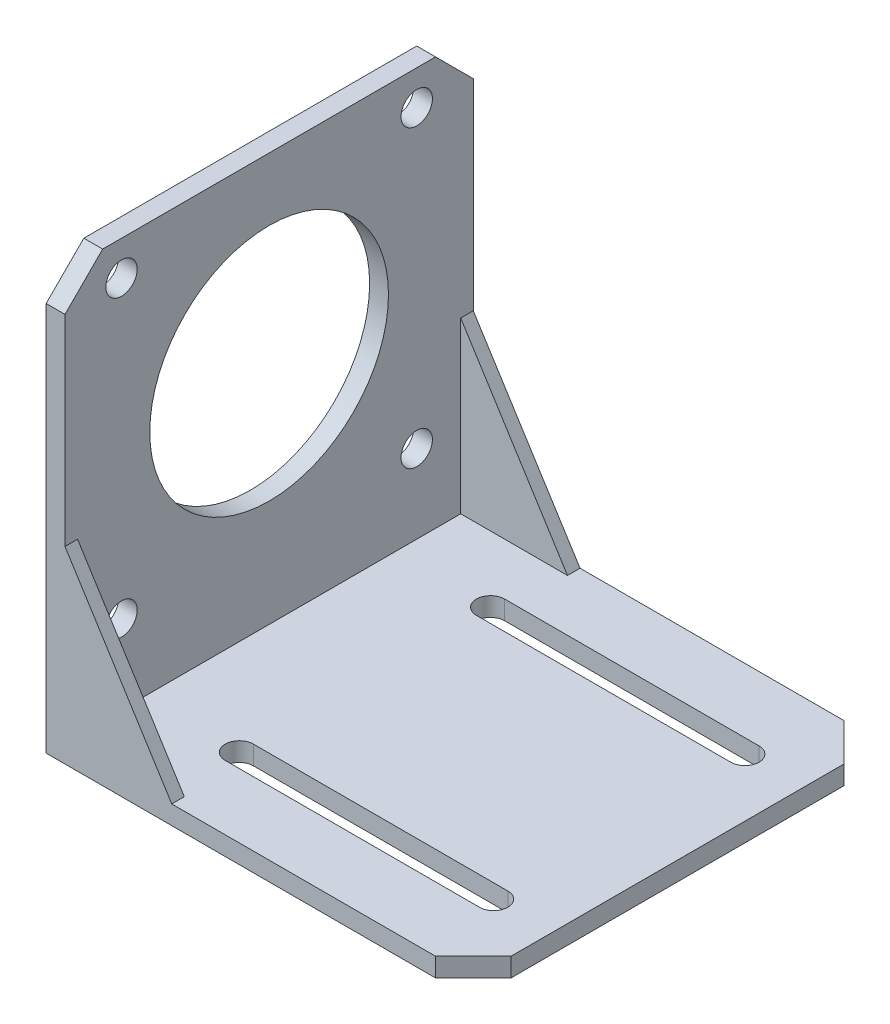
ISO-10303-21;
HEADER;
FILE_DESCRIPTION(('STEP AP214'),'2;1');
FILE_NAME('part.step','',(''),(''),'','','');
FILE_SCHEMA(('AUTOMOTIVE_DESIGN { 1 0 10303 214 1 1 1 1 }'));
ENDSEC;
DATA;
#1=APPLICATION_CONTEXT('core data for automotive mechanical design processes');
#2=APPLICATION_PROTOCOL_DEFINITION('international standard','automotive_design',2000,#1);
#3=PRODUCT_CONTEXT('',#1,'mechanical');
#4=PRODUCT('Part','Part','',(#3));
#5=PRODUCT_RELATED_PRODUCT_CATEGORY('part','',(#4));
#6=PRODUCT_DEFINITION_FORMATION('','',#4);
#7=PRODUCT_DEFINITION_CONTEXT('part definition',#1,'design');
#8=PRODUCT_DEFINITION('design','',#6,#7);
#9=PRODUCT_DEFINITION_SHAPE('','',#8);
#10=(LENGTH_UNIT() NAMED_UNIT(*) SI_UNIT(.MILLI.,.METRE.));
#11=(NAMED_UNIT(*) PLANE_ANGLE_UNIT() SI_UNIT($,.RADIAN.));
#12=(NAMED_UNIT(*) SI_UNIT($,.STERADIAN.) SOLID_ANGLE_UNIT());
#13=UNCERTAINTY_MEASURE_WITH_UNIT(LENGTH_MEASURE(1.E-05),#10,'distance_accuracy_value','');
#14=(GEOMETRIC_REPRESENTATION_CONTEXT(3) GLOBAL_UNCERTAINTY_ASSIGNED_CONTEXT((#13)) GLOBAL_UNIT_ASSIGNED_CONTEXT((#10,
#11,#12)) REPRESENTATION_CONTEXT('',''));
#15=CARTESIAN_POINT('',(0.,0.,0.));
#16=DIRECTION('',(0.,0.,1.));
#17=DIRECTION('',(1.,0.,0.));
#18=AXIS2_PLACEMENT_3D('',#15,#16,#17);
#19=CARTESIAN_POINT('',(68.,0.,65.));
#20=DIRECTION('',(0.,1.,0.));
#21=DIRECTION('',(0.,0.,1.));
#22=AXIS2_PLACEMENT_3D('',#19,#20,#21);
#23=PLANE('',#22);
#24=DIRECTION('',(0.707106781186545,0.,-0.70710678118655));
#25=VECTOR('',#24,1.);
#26=CARTESIAN_POINT('',(62.,0.,65.));
#27=LINE('',#26,#25);
#28=CARTESIAN_POINT('',(68.,0.,59.));
#29=VERTEX_POINT('',#28);
#30=CARTESIAN_POINT('',(62.,0.,65.));
#31=VERTEX_POINT('',#30);
#32=EDGE_CURVE('E402',#29,#31,#27,.F.);
#33=ORIENTED_EDGE('',*,*,#32,.T.);
#34=DIRECTION('',(1.,0.,0.));
#35=VECTOR('',#34,1.);
#36=CARTESIAN_POINT('',(68.,0.,65.));
#37=LINE('',#36,#35);
#38=CARTESIAN_POINT('',(0.,0.,65.));
#39=VERTEX_POINT('',#38);
#40=EDGE_CURVE('E353',#39,#31,#37,.T.);
#41=ORIENTED_EDGE('',*,*,#40,.F.);
#42=DIRECTION('',(0.,0.,-1.));
#43=VECTOR('',#42,1.);
#44=CARTESIAN_POINT('',(0.,0.,65.));
#45=LINE('',#44,#43);
#46=CARTESIAN_POINT('',(0.,0.,0.));
#47=VERTEX_POINT('',#46);
#48=EDGE_CURVE('E362',#39,#47,#45,.T.);
#49=ORIENTED_EDGE('',*,*,#48,.T.);
#50=DIRECTION('',(1.,0.,0.));
#51=VECTOR('',#50,1.);
#52=CARTESIAN_POINT('',(68.,0.,0.));
#53=LINE('',#52,#51);
#54=CARTESIAN_POINT('',(62.,0.,0.));
#55=VERTEX_POINT('',#54);
#56=EDGE_CURVE('E363',#47,#55,#53,.T.);
#57=ORIENTED_EDGE('',*,*,#56,.T.);
#58=DIRECTION('',(0.70710678118655,0.,0.707106781186546));
#59=VECTOR('',#58,1.);
#60=CARTESIAN_POINT('',(68.,0.,5.99999999999999));
#61=LINE('',#60,#59);
#62=CARTESIAN_POINT('',(68.,0.,6.));
#63=VERTEX_POINT('',#62);
#64=EDGE_CURVE('E405',#55,#63,#61,.T.);
#65=ORIENTED_EDGE('',*,*,#64,.T.);
#66=DIRECTION('',(0.,0.,-1.));
#67=VECTOR('',#66,1.);
#68=CARTESIAN_POINT('',(68.,0.,65.));
#69=LINE('',#68,#67);
#70=EDGE_CURVE('E384',#29,#63,#69,.T.);
#71=ORIENTED_EDGE('',*,*,#70,.F.);
#72=EDGE_LOOP('',(#33,#41,#49,#57,#65,#71));
#73=FACE_BOUND('',#72,.T.);
#74=DIRECTION('',(1.,0.,0.));
#75=VECTOR('',#74,1.);
#76=CARTESIAN_POINT('',(18.25,0.,50.25));
#77=LINE('',#76,#75);
#78=CARTESIAN_POINT('',(18.25,0.,50.25));
#79=VERTEX_POINT('',#78);
#80=CARTESIAN_POINT('',(58.75,0.,50.25));
#81=VERTEX_POINT('',#80);
#82=EDGE_CURVE('E505',#79,#81,#77,.T.);
#83=ORIENTED_EDGE('',*,*,#82,.F.);
#84=CARTESIAN_POINT('',(18.25,0.,52.5));
#85=DIRECTION('',(0.,1.,0.));
#86=DIRECTION('',(0.,0.,1.));
#87=AXIS2_PLACEMENT_3D('',#84,#85,#86);
#88=CIRCLE('',#87,2.25);
#89=CARTESIAN_POINT('',(18.25,0.,54.75));
#90=VERTEX_POINT('',#89);
#91=EDGE_CURVE('E513',#79,#90,#88,.T.);
#92=ORIENTED_EDGE('',*,*,#91,.T.);
#93=DIRECTION('',(1.,0.,0.));
#94=VECTOR('',#93,1.);
#95=CARTESIAN_POINT('',(18.25,0.,54.75));
#96=LINE('',#95,#94);
#97=CARTESIAN_POINT('',(58.75,0.,54.75));
#98=VERTEX_POINT('',#97);
#99=EDGE_CURVE('E502',#90,#98,#96,.T.);
#100=ORIENTED_EDGE('',*,*,#99,.T.);
#101=CARTESIAN_POINT('',(58.75,0.,52.5));
#102=DIRECTION('',(0.,1.,0.));
#103=DIRECTION('',(0.,0.,1.));
#104=AXIS2_PLACEMENT_3D('',#101,#102,#103);
#105=CIRCLE('',#104,2.25);
#106=EDGE_CURVE('E523',#98,#81,#105,.T.);
#107=ORIENTED_EDGE('',*,*,#106,.T.);
#108=EDGE_LOOP('',(#83,#92,#100,#107));
#109=FACE_BOUND('',#108,.T.);
#110=DIRECTION('',(1.,0.,0.));
#111=VECTOR('',#110,1.);
#112=CARTESIAN_POINT('',(18.25,0.,10.25));
#113=LINE('',#112,#111);
#114=CARTESIAN_POINT('',(18.25,0.,10.25));
#115=VERTEX_POINT('',#114);
#116=CARTESIAN_POINT('',(58.75,0.,10.25));
#117=VERTEX_POINT('',#116);
#118=EDGE_CURVE('E535',#115,#117,#113,.T.);
#119=ORIENTED_EDGE('',*,*,#118,.F.);
#120=CARTESIAN_POINT('',(18.25,0.,12.5));
#121=DIRECTION('',(0.,1.,0.));
#122=DIRECTION('',(0.,0.,1.));
#123=AXIS2_PLACEMENT_3D('',#120,#121,#122);
#124=CIRCLE('',#123,2.25);
#125=CARTESIAN_POINT('',(18.25,0.,14.75));
#126=VERTEX_POINT('',#125);
#127=EDGE_CURVE('E544',#115,#126,#124,.T.);
#128=ORIENTED_EDGE('',*,*,#127,.T.);
#129=DIRECTION('',(1.,0.,0.));
#130=VECTOR('',#129,1.);
#131=CARTESIAN_POINT('',(18.25,0.,14.75));
#132=LINE('',#131,#130);
#133=CARTESIAN_POINT('',(58.75,0.,14.75));
#134=VERTEX_POINT('',#133);
#135=EDGE_CURVE('E532',#126,#134,#132,.T.);
#136=ORIENTED_EDGE('',*,*,#135,.T.);
#137=CARTESIAN_POINT('',(58.75,0.,12.5));
#138=DIRECTION('',(0.,1.,0.));
#139=DIRECTION('',(0.,0.,1.));
#140=AXIS2_PLACEMENT_3D('',#137,#138,#139);
#141=CIRCLE('',#140,2.25);
#142=EDGE_CURVE('E554',#134,#117,#141,.T.);
#143=ORIENTED_EDGE('',*,*,#142,.T.);
#144=EDGE_LOOP('',(#119,#128,#136,#143));
#145=FACE_BOUND('',#144,.T.);
#146=ADVANCED_FACE('F182',(#73,#109,#145),#23,.F.);
#147=CARTESIAN_POINT('',(68.,3.,65.));
#148=DIRECTION('',(-1.,0.,0.));
#149=DIRECTION('',(0.,0.,1.));
#150=AXIS2_PLACEMENT_3D('',#147,#148,#149);
#151=PLANE('',#150);
#152=ORIENTED_EDGE('',*,*,#70,.T.);
#153=DIRECTION('',(0.,1.,0.));
#154=VECTOR('',#153,1.);
#155=CARTESIAN_POINT('',(68.,3.,5.99999999999999));
#156=LINE('',#155,#154);
#157=CARTESIAN_POINT('',(68.,3.,6.));
#158=VERTEX_POINT('',#157);
#159=EDGE_CURVE('E389',#63,#158,#156,.T.);
#160=ORIENTED_EDGE('',*,*,#159,.T.);
#161=DIRECTION('',(0.,0.,-1.));
#162=VECTOR('',#161,1.);
#163=CARTESIAN_POINT('',(68.,3.,65.));
#164=LINE('',#163,#162);
#165=CARTESIAN_POINT('',(68.,3.,59.));
#166=VERTEX_POINT('',#165);
#167=EDGE_CURVE('E381',#166,#158,#164,.T.);
#168=ORIENTED_EDGE('',*,*,#167,.F.);
#169=DIRECTION('',(0.,-1.,0.));
#170=VECTOR('',#169,1.);
#171=CARTESIAN_POINT('',(68.,3.,59.));
#172=LINE('',#171,#170);
#173=EDGE_CURVE('E387',#166,#29,#172,.T.);
#174=ORIENTED_EDGE('',*,*,#173,.T.);
#175=EDGE_LOOP('',(#152,#160,#168,#174));
#176=FACE_BOUND('',#175,.T.);
#177=ADVANCED_FACE('F587',(#176),#151,.F.);
#178=CARTESIAN_POINT('',(3.00000000000001,3.,65.));
#179=DIRECTION('',(0.,-1.,0.));
#180=DIRECTION('',(1.,0.,0.));
#181=AXIS2_PLACEMENT_3D('',#178,#179,#180);
#182=PLANE('',#181);
#183=DIRECTION('',(1.,0.,0.));
#184=VECTOR('',#183,1.);
#185=CARTESIAN_POINT('',(18.25,3.,50.25));
#186=LINE('',#185,#184);
#187=CARTESIAN_POINT('',(18.25,3.,50.25));
#188=VERTEX_POINT('',#187);
#189=CARTESIAN_POINT('',(58.75,3.,50.25));
#190=VERTEX_POINT('',#189);
#191=EDGE_CURVE('E507',#188,#190,#186,.T.);
#192=ORIENTED_EDGE('',*,*,#191,.T.);
#193=CARTESIAN_POINT('',(58.75,3.,52.5));
#194=DIRECTION('',(0.,1.,0.));
#195=DIRECTION('',(0.,0.,1.));
#196=AXIS2_PLACEMENT_3D('',#193,#194,#195);
#197=CIRCLE('',#196,2.24999999999999);
#198=CARTESIAN_POINT('',(58.75,3.,54.7500000000001));
#199=VERTEX_POINT('',#198);
#200=EDGE_CURVE('E520',#199,#190,#197,.T.);
#201=ORIENTED_EDGE('',*,*,#200,.F.);
#202=DIRECTION('',(1.,0.,0.));
#203=VECTOR('',#202,1.);
#204=CARTESIAN_POINT('',(18.25,3.,54.7500000000001));
#205=LINE('',#204,#203);
#206=CARTESIAN_POINT('',(18.25,3.,54.75));
#207=VERTEX_POINT('',#206);
#208=EDGE_CURVE('E500',#207,#199,#205,.T.);
#209=ORIENTED_EDGE('',*,*,#208,.F.);
#210=CARTESIAN_POINT('',(18.25,3.,52.5));
#211=DIRECTION('',(0.,1.,0.));
#212=DIRECTION('',(0.,0.,1.));
#213=AXIS2_PLACEMENT_3D('',#210,#211,#212);
#214=CIRCLE('',#213,2.24999999999999);
#215=EDGE_CURVE('E510',#188,#207,#214,.T.);
#216=ORIENTED_EDGE('',*,*,#215,.F.);
#217=EDGE_LOOP('',(#192,#201,#209,#216));
#218=FACE_BOUND('',#217,.T.);
#219=CARTESIAN_POINT('',(58.75,3.,12.5));
#220=DIRECTION('',(0.,1.,0.));
#221=DIRECTION('',(0.,0.,1.));
#222=AXIS2_PLACEMENT_3D('',#219,#220,#221);
#223=CIRCLE('',#222,2.24999999999999);
#224=CARTESIAN_POINT('',(58.75,3.,14.75));
#225=VERTEX_POINT('',#224);
#226=CARTESIAN_POINT('',(58.75,3.,10.25));
#227=VERTEX_POINT('',#226);
#228=EDGE_CURVE('E551',#225,#227,#223,.T.);
#229=ORIENTED_EDGE('',*,*,#228,.F.);
#230=DIRECTION('',(1.,0.,0.));
#231=VECTOR('',#230,1.);
#232=CARTESIAN_POINT('',(18.25,3.,14.75));
#233=LINE('',#232,#231);
#234=CARTESIAN_POINT('',(18.25,3.,14.75));
#235=VERTEX_POINT('',#234);
#236=EDGE_CURVE('E530',#235,#225,#233,.T.);
#237=ORIENTED_EDGE('',*,*,#236,.F.);
#238=CARTESIAN_POINT('',(18.25,3.,12.5));
#239=DIRECTION('',(0.,1.,0.));
#240=DIRECTION('',(0.,0.,1.));
#241=AXIS2_PLACEMENT_3D('',#238,#239,#240);
#242=CIRCLE('',#241,2.24999999999999);
#243=CARTESIAN_POINT('',(18.25,3.,10.25));
#244=VERTEX_POINT('',#243);
#245=EDGE_CURVE('E541',#244,#235,#242,.T.);
#246=ORIENTED_EDGE('',*,*,#245,.F.);
#247=DIRECTION('',(1.,0.,0.));
#248=VECTOR('',#247,1.);
#249=CARTESIAN_POINT('',(18.25,3.,10.25));
#250=LINE('',#249,#248);
#251=EDGE_CURVE('E538',#244,#227,#250,.T.);
#252=ORIENTED_EDGE('',*,*,#251,.T.);
#253=EDGE_LOOP('',(#229,#237,#246,#252));
#254=FACE_BOUND('',#253,.T.);
#255=DIRECTION('',(-1.,0.,0.));
#256=VECTOR('',#255,1.);
#257=CARTESIAN_POINT('',(3.00000000000001,3.,63.));
#258=LINE('',#257,#256);
#259=CARTESIAN_POINT('',(20.,3.,63.));
#260=VERTEX_POINT('',#259);
#261=CARTESIAN_POINT('',(3.00000000000001,3.,63.));
#262=VERTEX_POINT('',#261);
#263=EDGE_CURVE('E345',#260,#262,#258,.T.);
#264=ORIENTED_EDGE('',*,*,#263,.F.);
#265=DIRECTION('',(0.,0.,-1.));
#266=VECTOR('',#265,1.);
#267=CARTESIAN_POINT('',(20.,3.,65.));
#268=LINE('',#267,#266);
#269=CARTESIAN_POINT('',(20.,3.00000000000001,65.));
#270=VERTEX_POINT('',#269);
#271=EDGE_CURVE('E333',#260,#270,#268,.F.);
#272=ORIENTED_EDGE('',*,*,#271,.T.);
#273=DIRECTION('',(-1.,0.,0.));
#274=VECTOR('',#273,1.);
#275=CARTESIAN_POINT('',(3.00000000000001,3.,65.));
#276=LINE('',#275,#274);
#277=CARTESIAN_POINT('',(62.,3.,65.));
#278=VERTEX_POINT('',#277);
#279=EDGE_CURVE('E343',#278,#270,#276,.T.);
#280=ORIENTED_EDGE('',*,*,#279,.F.);
#281=DIRECTION('',(-0.707106781186545,0.,0.70710678118655));
#282=VECTOR('',#281,1.);
#283=CARTESIAN_POINT('',(62.,3.,65.));
#284=LINE('',#283,#282);
#285=EDGE_CURVE('E392',#278,#166,#284,.F.);
#286=ORIENTED_EDGE('',*,*,#285,.T.);
#287=ORIENTED_EDGE('',*,*,#167,.T.);
#288=DIRECTION('',(-0.70710678118655,0.,-0.707106781186546));
#289=VECTOR('',#288,1.);
#290=CARTESIAN_POINT('',(68.,3.,5.99999999999999));
#291=LINE('',#290,#289);
#292=CARTESIAN_POINT('',(62.,3.,0.));
#293=VERTEX_POINT('',#292);
#294=EDGE_CURVE('E394',#158,#293,#291,.T.);
#295=ORIENTED_EDGE('',*,*,#294,.T.);
#296=DIRECTION('',(-1.,0.,0.));
#297=VECTOR('',#296,1.);
#298=CARTESIAN_POINT('',(3.00000000000001,3.,0.));
#299=LINE('',#298,#297);
#300=CARTESIAN_POINT('',(20.,3.,0.));
#301=VERTEX_POINT('',#300);
#302=EDGE_CURVE('E365',#293,#301,#299,.T.);
#303=ORIENTED_EDGE('',*,*,#302,.T.);
#304=DIRECTION('',(0.,0.,-1.));
#305=VECTOR('',#304,1.);
#306=CARTESIAN_POINT('',(20.,3.,65.));
#307=LINE('',#306,#305);
#308=CARTESIAN_POINT('',(20.,3.,2.));
#309=VERTEX_POINT('',#308);
#310=EDGE_CURVE('E205',#301,#309,#307,.F.);
#311=ORIENTED_EDGE('',*,*,#310,.T.);
#312=DIRECTION('',(-1.,0.,0.));
#313=VECTOR('',#312,1.);
#314=CARTESIAN_POINT('',(3.00000000000001,3.,2.));
#315=LINE('',#314,#313);
#316=CARTESIAN_POINT('',(3.00000000000001,3.,2.));
#317=VERTEX_POINT('',#316);
#318=EDGE_CURVE('E468',#309,#317,#315,.T.);
#319=ORIENTED_EDGE('',*,*,#318,.T.);
#320=DIRECTION('',(0.,0.,-1.));
#321=VECTOR('',#320,1.);
#322=CARTESIAN_POINT('',(3.00000000000001,3.,65.));
#323=LINE('',#322,#321);
#324=EDGE_CURVE('E379',#262,#317,#323,.T.);
#325=ORIENTED_EDGE('',*,*,#324,.F.);
#326=EDGE_LOOP('',(#264,#272,#280,#286,#287,#295,#303,#311,#319,#325));
#327=FACE_BOUND('',#326,.T.);
#328=ADVANCED_FACE('F342',(#218,#254,#327),#182,.F.);
#329=CARTESIAN_POINT('',(3.,68.,65.));
#330=DIRECTION('',(-1.,0.,0.));
#331=DIRECTION('',(0.,-1.,0.));
#332=AXIS2_PLACEMENT_3D('',#329,#330,#331);
#333=PLANE('',#332);
#334=CARTESIAN_POINT('',(3.,62.5,9.00000000000001));
#335=DIRECTION('',(-1.,0.,0.));
#336=DIRECTION('',(0.,-1.,0.));
#337=AXIS2_PLACEMENT_3D('',#334,#335,#336);
#338=CIRCLE('',#337,2.5);
#339=CARTESIAN_POINT('',(3.,60.,9.00000000000001));
#340=VERTEX_POINT('',#339);
#341=EDGE_CURVE('E473',#340,#340,#338,.T.);
#342=ORIENTED_EDGE('',*,*,#341,.T.);
#343=EDGE_LOOP('',(#342));
#344=FACE_BOUND('',#343,.T.);
#345=CARTESIAN_POINT('',(3.,62.5,56.));
#346=DIRECTION('',(-1.,0.,0.));
#347=DIRECTION('',(0.,-1.,0.));
#348=AXIS2_PLACEMENT_3D('',#345,#346,#347);
#349=CIRCLE('',#348,2.5);
#350=CARTESIAN_POINT('',(3.,60.,56.));
#351=VERTEX_POINT('',#350);
#352=EDGE_CURVE('E479',#351,#351,#349,.T.);
#353=ORIENTED_EDGE('',*,*,#352,.T.);
#354=EDGE_LOOP('',(#353));
#355=FACE_BOUND('',#354,.T.);
#356=CARTESIAN_POINT('',(3.00000000000001,15.5,9.00000000000001));
#357=DIRECTION('',(-1.,0.,0.));
#358=DIRECTION('',(0.,-1.,0.));
#359=AXIS2_PLACEMENT_3D('',#356,#357,#358);
#360=CIRCLE('',#359,2.5);
#361=CARTESIAN_POINT('',(3.00000000000001,13.,9.00000000000001));
#362=VERTEX_POINT('',#361);
#363=EDGE_CURVE('E485',#362,#362,#360,.T.);
#364=ORIENTED_EDGE('',*,*,#363,.T.);
#365=EDGE_LOOP('',(#364));
#366=FACE_BOUND('',#365,.T.);
#367=CARTESIAN_POINT('',(3.00000000000001,15.5,56.));
#368=DIRECTION('',(-1.,0.,0.));
#369=DIRECTION('',(0.,-1.,0.));
#370=AXIS2_PLACEMENT_3D('',#367,#368,#369);
#371=CIRCLE('',#370,2.5);
#372=CARTESIAN_POINT('',(3.00000000000001,13.,56.));
#373=VERTEX_POINT('',#372);
#374=EDGE_CURVE('E491',#373,#373,#371,.T.);
#375=ORIENTED_EDGE('',*,*,#374,.T.);
#376=EDGE_LOOP('',(#375));
#377=FACE_BOUND('',#376,.T.);
#378=CARTESIAN_POINT('',(3.00000000000001,39.,32.5));
#379=DIRECTION('',(-1.,0.,0.));
#380=DIRECTION('',(0.,-1.,0.));
#381=AXIS2_PLACEMENT_3D('',#378,#379,#380);
#382=CIRCLE('',#381,19.);
#383=CARTESIAN_POINT('',(3.00000000000001,20.,32.5));
#384=VERTEX_POINT('',#383);
#385=EDGE_CURVE('E497',#384,#384,#382,.T.);
#386=ORIENTED_EDGE('',*,*,#385,.T.);
#387=EDGE_LOOP('',(#386));
#388=FACE_BOUND('',#387,.T.);
#389=DIRECTION('',(0.,1.,0.));
#390=VECTOR('',#389,1.);
#391=CARTESIAN_POINT('',(3.,68.,65.));
#392=LINE('',#391,#390);
#393=CARTESIAN_POINT('',(3.,30.,65.));
#394=VERTEX_POINT('',#393);
#395=CARTESIAN_POINT('',(3.,62.,65.));
#396=VERTEX_POINT('',#395);
#397=EDGE_CURVE('E352',#394,#396,#392,.T.);
#398=ORIENTED_EDGE('',*,*,#397,.F.);
#399=DIRECTION('',(0.,0.,1.));
#400=VECTOR('',#399,1.);
#401=CARTESIAN_POINT('',(3.,30.,65.));
#402=LINE('',#401,#400);
#403=CARTESIAN_POINT('',(3.00000000000001,30.,63.));
#404=VERTEX_POINT('',#403);
#405=EDGE_CURVE('E336',#394,#404,#402,.F.);
#406=ORIENTED_EDGE('',*,*,#405,.T.);
#407=DIRECTION('',(0.,1.,0.));
#408=VECTOR('',#407,1.);
#409=CARTESIAN_POINT('',(3.,68.,63.));
#410=LINE('',#409,#408);
#411=EDGE_CURVE('E346',#262,#404,#410,.T.);
#412=ORIENTED_EDGE('',*,*,#411,.F.);
#413=ORIENTED_EDGE('',*,*,#324,.T.);
#414=DIRECTION('',(0.,1.,0.));
#415=VECTOR('',#414,1.);
#416=CARTESIAN_POINT('',(3.,68.,2.));
#417=LINE('',#416,#415);
#418=CARTESIAN_POINT('',(3.00000000000001,30.,2.));
#419=VERTEX_POINT('',#418);
#420=EDGE_CURVE('E466',#317,#419,#417,.T.);
#421=ORIENTED_EDGE('',*,*,#420,.T.);
#422=DIRECTION('',(0.,0.,1.));
#423=VECTOR('',#422,1.);
#424=CARTESIAN_POINT('',(3.,30.,65.));
#425=LINE('',#424,#423);
#426=CARTESIAN_POINT('',(3.,30.,0.));
#427=VERTEX_POINT('',#426);
#428=EDGE_CURVE('E461',#419,#427,#425,.F.);
#429=ORIENTED_EDGE('',*,*,#428,.T.);
#430=DIRECTION('',(0.,1.,0.));
#431=VECTOR('',#430,1.);
#432=CARTESIAN_POINT('',(3.,68.,0.));
#433=LINE('',#432,#431);
#434=CARTESIAN_POINT('',(3.,62.,0.));
#435=VERTEX_POINT('',#434);
#436=EDGE_CURVE('E368',#427,#435,#433,.T.);
#437=ORIENTED_EDGE('',*,*,#436,.T.);
#438=DIRECTION('',(0.,0.70710678118655,0.707106781186546));
#439=VECTOR('',#438,1.);
#440=CARTESIAN_POINT('',(3.,68.,5.99999999999999));
#441=LINE('',#440,#439);
#442=CARTESIAN_POINT('',(3.,68.,6.));
#443=VERTEX_POINT('',#442);
#444=EDGE_CURVE('E190',#435,#443,#441,.T.);
#445=ORIENTED_EDGE('',*,*,#444,.T.);
#446=DIRECTION('',(0.,0.,-1.));
#447=VECTOR('',#446,1.);
#448=CARTESIAN_POINT('',(3.,68.,65.));
#449=LINE('',#448,#447);
#450=CARTESIAN_POINT('',(3.,68.,59.));
#451=VERTEX_POINT('',#450);
#452=EDGE_CURVE('E376',#451,#443,#449,.T.);
#453=ORIENTED_EDGE('',*,*,#452,.F.);
#454=DIRECTION('',(0.,0.707106781186545,-0.70710678118655));
#455=VECTOR('',#454,1.);
#456=CARTESIAN_POINT('',(3.,62.,65.));
#457=LINE('',#456,#455);
#458=EDGE_CURVE('E13',#451,#396,#457,.F.);
#459=ORIENTED_EDGE('',*,*,#458,.T.);
#460=EDGE_LOOP('',(#398,#406,#412,#413,#421,#429,#437,#445,#453,#459));
#461=FACE_BOUND('',#460,.T.);
#462=ADVANCED_FACE('F422',(#344,#355,#366,#377,#388,#461),#333,.F.);
#463=CARTESIAN_POINT('',(0.,68.,65.));
#464=DIRECTION('',(0.,-1.,0.));
#465=DIRECTION('',(0.,0.,-1.));
#466=AXIS2_PLACEMENT_3D('',#463,#464,#465);
#467=PLANE('',#466);
#468=DIRECTION('',(0.,0.,-1.));
#469=VECTOR('',#468,1.);
#470=CARTESIAN_POINT('',(0.,68.,65.));
#471=LINE('',#470,#469);
#472=CARTESIAN_POINT('',(0.,68.,59.));
#473=VERTEX_POINT('',#472);
#474=CARTESIAN_POINT('',(0.,68.,6.));
#475=VERTEX_POINT('',#474);
#476=EDGE_CURVE('E373',#473,#475,#471,.T.);
#477=ORIENTED_EDGE('',*,*,#476,.F.);
#478=DIRECTION('',(1.,0.,0.));
#479=VECTOR('',#478,1.);
#480=CARTESIAN_POINT('',(0.,68.,59.));
#481=LINE('',#480,#479);
#482=EDGE_CURVE('E418',#473,#451,#481,.T.);
#483=ORIENTED_EDGE('',*,*,#482,.T.);
#484=ORIENTED_EDGE('',*,*,#452,.T.);
#485=DIRECTION('',(-1.,0.,0.));
#486=VECTOR('',#485,1.);
#487=CARTESIAN_POINT('',(0.,68.,5.99999999999999));
#488=LINE('',#487,#486);
#489=EDGE_CURVE('E415',#443,#475,#488,.T.);
#490=ORIENTED_EDGE('',*,*,#489,.T.);
#491=EDGE_LOOP('',(#477,#483,#484,#490));
#492=FACE_BOUND('',#491,.T.);
#493=ADVANCED_FACE('F430',(#492),#467,.F.);
#494=CARTESIAN_POINT('',(0.,0.,65.));
#495=DIRECTION('',(1.,0.,0.));
#496=DIRECTION('',(0.,0.,-1.));
#497=AXIS2_PLACEMENT_3D('',#494,#495,#496);
#498=PLANE('',#497);
#499=ORIENTED_EDGE('',*,*,#48,.F.);
#500=DIRECTION('',(0.,-1.,0.));
#501=VECTOR('',#500,1.);
#502=CARTESIAN_POINT('',(0.,0.,65.));
#503=LINE('',#502,#501);
#504=CARTESIAN_POINT('',(0.,62.,65.));
#505=VERTEX_POINT('',#504);
#506=EDGE_CURVE('E355',#505,#39,#503,.T.);
#507=ORIENTED_EDGE('',*,*,#506,.F.);
#508=DIRECTION('',(0.,-0.707106781186545,0.70710678118655));
#509=VECTOR('',#508,1.);
#510=CARTESIAN_POINT('',(0.,62.,65.));
#511=LINE('',#510,#509);
#512=EDGE_CURVE('E413',#505,#473,#511,.F.);
#513=ORIENTED_EDGE('',*,*,#512,.T.);
#514=ORIENTED_EDGE('',*,*,#476,.T.);
#515=DIRECTION('',(0.,-0.70710678118655,-0.707106781186546));
#516=VECTOR('',#515,1.);
#517=CARTESIAN_POINT('',(0.,68.,5.99999999999999));
#518=LINE('',#517,#516);
#519=CARTESIAN_POINT('',(0.,62.,0.));
#520=VERTEX_POINT('',#519);
#521=EDGE_CURVE('E411',#475,#520,#518,.T.);
#522=ORIENTED_EDGE('',*,*,#521,.T.);
#523=DIRECTION('',(0.,-1.,0.));
#524=VECTOR('',#523,1.);
#525=CARTESIAN_POINT('',(0.,0.,0.));
#526=LINE('',#525,#524);
#527=EDGE_CURVE('E357',#520,#47,#526,.T.);
#528=ORIENTED_EDGE('',*,*,#527,.T.);
#529=EDGE_LOOP('',(#499,#507,#513,#514,#522,#528));
#530=FACE_BOUND('',#529,.T.);
#531=CARTESIAN_POINT('',(0.,62.5,9.00000000000001));
#532=DIRECTION('',(-1.,0.,0.));
#533=DIRECTION('',(0.,0.,1.));
#534=AXIS2_PLACEMENT_3D('',#531,#532,#533);
#535=CIRCLE('',#534,2.5);
#536=CARTESIAN_POINT('',(0.,62.5,11.5));
#537=VERTEX_POINT('',#536);
#538=EDGE_CURVE('E470',#537,#537,#535,.T.);
#539=ORIENTED_EDGE('',*,*,#538,.F.);
#540=EDGE_LOOP('',(#539));
#541=FACE_BOUND('',#540,.T.);
#542=CARTESIAN_POINT('',(0.,62.5,56.));
#543=DIRECTION('',(-1.,0.,0.));
#544=DIRECTION('',(0.,0.,1.));
#545=AXIS2_PLACEMENT_3D('',#542,#543,#544);
#546=CIRCLE('',#545,2.5);
#547=CARTESIAN_POINT('',(0.,62.5,58.5));
#548=VERTEX_POINT('',#547);
#549=EDGE_CURVE('E476',#548,#548,#546,.T.);
#550=ORIENTED_EDGE('',*,*,#549,.F.);
#551=EDGE_LOOP('',(#550));
#552=FACE_BOUND('',#551,.T.);
#553=CARTESIAN_POINT('',(0.,15.5,9.00000000000001));
#554=DIRECTION('',(-1.,0.,0.));
#555=DIRECTION('',(0.,0.,1.));
#556=AXIS2_PLACEMENT_3D('',#553,#554,#555);
#557=CIRCLE('',#556,2.5);
#558=CARTESIAN_POINT('',(0.,15.5,11.5));
#559=VERTEX_POINT('',#558);
#560=EDGE_CURVE('E482',#559,#559,#557,.T.);
#561=ORIENTED_EDGE('',*,*,#560,.F.);
#562=EDGE_LOOP('',(#561));
#563=FACE_BOUND('',#562,.T.);
#564=CARTESIAN_POINT('',(0.,15.5,56.));
#565=DIRECTION('',(-1.,0.,0.));
#566=DIRECTION('',(0.,0.,1.));
#567=AXIS2_PLACEMENT_3D('',#564,#565,#566);
#568=CIRCLE('',#567,2.5);
#569=CARTESIAN_POINT('',(0.,15.5,58.5));
#570=VERTEX_POINT('',#569);
#571=EDGE_CURVE('E488',#570,#570,#568,.T.);
#572=ORIENTED_EDGE('',*,*,#571,.F.);
#573=EDGE_LOOP('',(#572));
#574=FACE_BOUND('',#573,.T.);
#575=CARTESIAN_POINT('',(0.,39.,32.5));
#576=DIRECTION('',(-1.,0.,0.));
#577=DIRECTION('',(0.,0.,1.));
#578=AXIS2_PLACEMENT_3D('',#575,#576,#577);
#579=CIRCLE('',#578,19.);
#580=CARTESIAN_POINT('',(0.,39.,51.5));
#581=VERTEX_POINT('',#580);
#582=EDGE_CURVE('E494',#581,#581,#579,.T.);
#583=ORIENTED_EDGE('',*,*,#582,.F.);
#584=EDGE_LOOP('',(#583));
#585=FACE_BOUND('',#584,.T.);
#586=ADVANCED_FACE('F435',(#530,#541,#552,#563,#574,#585),#498,.F.);
#587=CARTESIAN_POINT('',(0.,0.,65.));
#588=DIRECTION('',(0.,0.,-1.));
#589=DIRECTION('',(-1.,0.,0.));
#590=AXIS2_PLACEMENT_3D('',#587,#588,#589);
#591=PLANE('',#590);
#592=ORIENTED_EDGE('',*,*,#279,.T.);
#593=DIRECTION('',(0.532813269686139,-0.846232840089751,0.));
#594=VECTOR('',#593,1.);
#595=CARTESIAN_POINT('',(3.00000000000001,30.,65.));
#596=LINE('',#595,#594);
#597=EDGE_CURVE('E197',#394,#270,#596,.T.);
#598=ORIENTED_EDGE('',*,*,#597,.F.);
#599=ORIENTED_EDGE('',*,*,#397,.T.);
#600=DIRECTION('',(-1.,0.,0.));
#601=VECTOR('',#600,1.);
#602=CARTESIAN_POINT('',(0.,62.,65.));
#603=LINE('',#602,#601);
#604=EDGE_CURVE('E407',#396,#505,#603,.T.);
#605=ORIENTED_EDGE('',*,*,#604,.T.);
#606=ORIENTED_EDGE('',*,*,#506,.T.);
#607=ORIENTED_EDGE('',*,*,#40,.T.);
#608=DIRECTION('',(0.,1.,0.));
#609=VECTOR('',#608,1.);
#610=CARTESIAN_POINT('',(62.,0.,65.));
#611=LINE('',#610,#609);
#612=EDGE_CURVE('E351',#31,#278,#611,.T.);
#613=ORIENTED_EDGE('',*,*,#612,.T.);
#614=EDGE_LOOP('',(#592,#598,#599,#605,#606,#607,#613));
#615=FACE_BOUND('',#614,.T.);
#616=ADVANCED_FACE('F349',(#615),#591,.F.);
#617=CARTESIAN_POINT('',(0.,0.,0.));
#618=DIRECTION('',(0.,0.,-1.));
#619=DIRECTION('',(-1.,0.,0.));
#620=AXIS2_PLACEMENT_3D('',#617,#618,#619);
#621=PLANE('',#620);
#622=DIRECTION('',(0.,-1.,0.));
#623=VECTOR('',#622,1.);
#624=CARTESIAN_POINT('',(62.,0.,0.));
#625=LINE('',#624,#623);
#626=EDGE_CURVE('E399',#293,#55,#625,.T.);
#627=ORIENTED_EDGE('',*,*,#626,.T.);
#628=ORIENTED_EDGE('',*,*,#56,.F.);
#629=ORIENTED_EDGE('',*,*,#527,.F.);
#630=DIRECTION('',(1.,0.,0.));
#631=VECTOR('',#630,1.);
#632=CARTESIAN_POINT('',(3.,62.,0.));
#633=LINE('',#632,#631);
#634=EDGE_CURVE('E396',#520,#435,#633,.T.);
#635=ORIENTED_EDGE('',*,*,#634,.T.);
#636=ORIENTED_EDGE('',*,*,#436,.F.);
#637=DIRECTION('',(0.532813269686139,-0.846232840089751,0.));
#638=VECTOR('',#637,1.);
#639=CARTESIAN_POINT('',(3.00000000000001,30.,0.));
#640=LINE('',#639,#638);
#641=EDGE_CURVE('E457',#427,#301,#640,.T.);
#642=ORIENTED_EDGE('',*,*,#641,.T.);
#643=ORIENTED_EDGE('',*,*,#302,.F.);
#644=EDGE_LOOP('',(#627,#628,#629,#635,#636,#642,#643));
#645=FACE_BOUND('',#644,.T.);
#646=ADVANCED_FACE('F439',(#645),#621,.T.);
#647=CARTESIAN_POINT('',(58.75,3.,12.5));
#648=DIRECTION('',(0.,1.,0.));
#649=DIRECTION('',(0.,0.,1.));
#650=AXIS2_PLACEMENT_3D('',#647,#648,#649);
#651=CYLINDRICAL_SURFACE('',#650,2.25);
#652=ORIENTED_EDGE('',*,*,#142,.F.);
#653=DIRECTION('',(0.,1.,0.));
#654=VECTOR('',#653,1.);
#655=CARTESIAN_POINT('',(58.75,3.,14.75));
#656=LINE('',#655,#654);
#657=EDGE_CURVE('E366',#225,#134,#656,.F.);
#658=ORIENTED_EDGE('',*,*,#657,.F.);
#659=ORIENTED_EDGE('',*,*,#228,.T.);
#660=DIRECTION('',(0.,1.,0.));
#661=VECTOR('',#660,1.);
#662=CARTESIAN_POINT('',(58.75,3.,10.25));
#663=LINE('',#662,#661);
#664=EDGE_CURVE('E557',#117,#227,#663,.T.);
#665=ORIENTED_EDGE('',*,*,#664,.F.);
#666=EDGE_LOOP('',(#652,#658,#659,#665));
#667=FACE_BOUND('',#666,.T.);
#668=ADVANCED_FACE('F574',(#667),#651,.F.);
#669=CARTESIAN_POINT('',(18.25,3.,12.5));
#670=DIRECTION('',(0.,1.,0.));
#671=DIRECTION('',(0.,0.,1.));
#672=AXIS2_PLACEMENT_3D('',#669,#670,#671);
#673=CYLINDRICAL_SURFACE('',#672,2.25);
#674=ORIENTED_EDGE('',*,*,#245,.T.);
#675=DIRECTION('',(0.,1.,0.));
#676=VECTOR('',#675,1.);
#677=CARTESIAN_POINT('',(18.25,3.,14.75));
#678=LINE('',#677,#676);
#679=EDGE_CURVE('E547',#126,#235,#678,.T.);
#680=ORIENTED_EDGE('',*,*,#679,.F.);
#681=ORIENTED_EDGE('',*,*,#127,.F.);
#682=DIRECTION('',(0.,1.,0.));
#683=VECTOR('',#682,1.);
#684=CARTESIAN_POINT('',(18.25,3.,10.25));
#685=LINE('',#684,#683);
#686=EDGE_CURVE('E549',#244,#115,#685,.F.);
#687=ORIENTED_EDGE('',*,*,#686,.F.);
#688=EDGE_LOOP('',(#674,#680,#681,#687));
#689=FACE_BOUND('',#688,.T.);
#690=ADVANCED_FACE('F570',(#689),#673,.F.);
#691=CARTESIAN_POINT('',(18.25,3.,10.25));
#692=DIRECTION('',(0.,0.,-1.));
#693=DIRECTION('',(-1.,0.,0.));
#694=AXIS2_PLACEMENT_3D('',#691,#692,#693);
#695=PLANE('',#694);
#696=ORIENTED_EDGE('',*,*,#664,.T.);
#697=ORIENTED_EDGE('',*,*,#251,.F.);
#698=ORIENTED_EDGE('',*,*,#686,.T.);
#699=ORIENTED_EDGE('',*,*,#118,.T.);
#700=EDGE_LOOP('',(#696,#697,#698,#699));
#701=FACE_BOUND('',#700,.T.);
#702=ADVANCED_FACE('F576',(#701),#695,.F.);
#703=CARTESIAN_POINT('',(18.25,3.,14.75));
#704=DIRECTION('',(0.,0.,1.));
#705=DIRECTION('',(1.,0.,0.));
#706=AXIS2_PLACEMENT_3D('',#703,#704,#705);
#707=PLANE('',#706);
#708=ORIENTED_EDGE('',*,*,#657,.T.);
#709=ORIENTED_EDGE('',*,*,#135,.F.);
#710=ORIENTED_EDGE('',*,*,#679,.T.);
#711=ORIENTED_EDGE('',*,*,#236,.T.);
#712=EDGE_LOOP('',(#708,#709,#710,#711));
#713=FACE_BOUND('',#712,.T.);
#714=ADVANCED_FACE('F561',(#713),#707,.F.);
#715=CARTESIAN_POINT('',(58.75,3.,52.5));
#716=DIRECTION('',(0.,1.,0.));
#717=DIRECTION('',(0.,0.,1.));
#718=AXIS2_PLACEMENT_3D('',#715,#716,#717);
#719=CYLINDRICAL_SURFACE('',#718,2.25);
#720=ORIENTED_EDGE('',*,*,#106,.F.);
#721=DIRECTION('',(0.,1.,0.));
#722=VECTOR('',#721,1.);
#723=CARTESIAN_POINT('',(58.75,3.,54.75));
#724=LINE('',#723,#722);
#725=EDGE_CURVE('E528',#199,#98,#724,.F.);
#726=ORIENTED_EDGE('',*,*,#725,.F.);
#727=ORIENTED_EDGE('',*,*,#200,.T.);
#728=DIRECTION('',(0.,1.,0.));
#729=VECTOR('',#728,1.);
#730=CARTESIAN_POINT('',(58.75,3.,50.25));
#731=LINE('',#730,#729);
#732=EDGE_CURVE('E526',#81,#190,#731,.T.);
#733=ORIENTED_EDGE('',*,*,#732,.F.);
#734=EDGE_LOOP('',(#720,#726,#727,#733));
#735=FACE_BOUND('',#734,.T.);
#736=ADVANCED_FACE('F583',(#735),#719,.F.);
#737=CARTESIAN_POINT('',(18.25,3.,52.5));
#738=DIRECTION('',(0.,1.,0.));
#739=DIRECTION('',(0.,0.,1.));
#740=AXIS2_PLACEMENT_3D('',#737,#738,#739);
#741=CYLINDRICAL_SURFACE('',#740,2.25);
#742=ORIENTED_EDGE('',*,*,#215,.T.);
#743=DIRECTION('',(0.,1.,0.));
#744=VECTOR('',#743,1.);
#745=CARTESIAN_POINT('',(18.25,3.,54.75));
#746=LINE('',#745,#744);
#747=EDGE_CURVE('E516',#90,#207,#746,.T.);
#748=ORIENTED_EDGE('',*,*,#747,.F.);
#749=ORIENTED_EDGE('',*,*,#91,.F.);
#750=DIRECTION('',(0.,1.,0.));
#751=VECTOR('',#750,1.);
#752=CARTESIAN_POINT('',(18.25,3.,50.25));
#753=LINE('',#752,#751);
#754=EDGE_CURVE('E518',#188,#79,#753,.F.);
#755=ORIENTED_EDGE('',*,*,#754,.F.);
#756=EDGE_LOOP('',(#742,#748,#749,#755));
#757=FACE_BOUND('',#756,.T.);
#758=ADVANCED_FACE('F650',(#757),#741,.F.);
#759=CARTESIAN_POINT('',(18.25,3.,50.25));
#760=DIRECTION('',(0.,0.,-1.));
#761=DIRECTION('',(-1.,0.,0.));
#762=AXIS2_PLACEMENT_3D('',#759,#760,#761);
#763=PLANE('',#762);
#764=ORIENTED_EDGE('',*,*,#732,.T.);
#765=ORIENTED_EDGE('',*,*,#191,.F.);
#766=ORIENTED_EDGE('',*,*,#754,.T.);
#767=ORIENTED_EDGE('',*,*,#82,.T.);
#768=EDGE_LOOP('',(#764,#765,#766,#767));
#769=FACE_BOUND('',#768,.T.);
#770=ADVANCED_FACE('F646',(#769),#763,.F.);
#771=CARTESIAN_POINT('',(18.25,3.,54.75));
#772=DIRECTION('',(0.,0.,1.));
#773=DIRECTION('',(1.,0.,0.));
#774=AXIS2_PLACEMENT_3D('',#771,#772,#773);
#775=PLANE('',#774);
#776=ORIENTED_EDGE('',*,*,#725,.T.);
#777=ORIENTED_EDGE('',*,*,#99,.F.);
#778=ORIENTED_EDGE('',*,*,#747,.T.);
#779=ORIENTED_EDGE('',*,*,#208,.T.);
#780=EDGE_LOOP('',(#776,#777,#778,#779));
#781=FACE_BOUND('',#780,.T.);
#782=ADVANCED_FACE('F642',(#781),#775,.F.);
#783=CARTESIAN_POINT('',(65.,39.,32.5));
#784=DIRECTION('',(-1.,0.,0.));
#785=DIRECTION('',(0.,0.,1.));
#786=AXIS2_PLACEMENT_3D('',#783,#784,#785);
#787=CYLINDRICAL_SURFACE('',#786,19.);
#788=ORIENTED_EDGE('',*,*,#582,.T.);
#789=EDGE_LOOP('',(#788));
#790=FACE_BOUND('',#789,.T.);
#791=ORIENTED_EDGE('',*,*,#385,.F.);
#792=EDGE_LOOP('',(#791));
#793=FACE_BOUND('',#792,.T.);
#794=ADVANCED_FACE('F638',(#790,#793),#787,.F.);
#795=CARTESIAN_POINT('',(0.,15.5,56.));
#796=DIRECTION('',(-1.,0.,0.));
#797=DIRECTION('',(0.,0.,1.));
#798=AXIS2_PLACEMENT_3D('',#795,#796,#797);
#799=CYLINDRICAL_SURFACE('',#798,2.5);
#800=ORIENTED_EDGE('',*,*,#571,.T.);
#801=EDGE_LOOP('',(#800));
#802=FACE_BOUND('',#801,.T.);
#803=ORIENTED_EDGE('',*,*,#374,.F.);
#804=EDGE_LOOP('',(#803));
#805=FACE_BOUND('',#804,.T.);
#806=ADVANCED_FACE('F634',(#802,#805),#799,.F.);
#807=CARTESIAN_POINT('',(0.,15.5,9.00000000000001));
#808=DIRECTION('',(-1.,0.,0.));
#809=DIRECTION('',(0.,0.,1.));
#810=AXIS2_PLACEMENT_3D('',#807,#808,#809);
#811=CYLINDRICAL_SURFACE('',#810,2.5);
#812=ORIENTED_EDGE('',*,*,#560,.T.);
#813=EDGE_LOOP('',(#812));
#814=FACE_BOUND('',#813,.T.);
#815=ORIENTED_EDGE('',*,*,#363,.F.);
#816=EDGE_LOOP('',(#815));
#817=FACE_BOUND('',#816,.T.);
#818=ADVANCED_FACE('F630',(#814,#817),#811,.F.);
#819=CARTESIAN_POINT('',(0.,62.5,56.));
#820=DIRECTION('',(-1.,0.,0.));
#821=DIRECTION('',(0.,0.,1.));
#822=AXIS2_PLACEMENT_3D('',#819,#820,#821);
#823=CYLINDRICAL_SURFACE('',#822,2.5);
#824=ORIENTED_EDGE('',*,*,#549,.T.);
#825=EDGE_LOOP('',(#824));
#826=FACE_BOUND('',#825,.T.);
#827=ORIENTED_EDGE('',*,*,#352,.F.);
#828=EDGE_LOOP('',(#827));
#829=FACE_BOUND('',#828,.T.);
#830=ADVANCED_FACE('F626',(#826,#829),#823,.F.);
#831=CARTESIAN_POINT('',(0.,62.5,9.00000000000001));
#832=DIRECTION('',(-1.,0.,0.));
#833=DIRECTION('',(0.,0.,1.));
#834=AXIS2_PLACEMENT_3D('',#831,#832,#833);
#835=CYLINDRICAL_SURFACE('',#834,2.5);
#836=ORIENTED_EDGE('',*,*,#538,.T.);
#837=EDGE_LOOP('',(#836));
#838=FACE_BOUND('',#837,.T.);
#839=ORIENTED_EDGE('',*,*,#341,.F.);
#840=EDGE_LOOP('',(#839));
#841=FACE_BOUND('',#840,.T.);
#842=ADVANCED_FACE('F600',(#838,#841),#835,.F.);
#843=CARTESIAN_POINT('',(68.,3.,5.99999999999999));
#844=DIRECTION('',(0.707106781186546,0.,-0.70710678118655));
#845=DIRECTION('',(0.,-1.,0.));
#846=AXIS2_PLACEMENT_3D('',#843,#844,#845);
#847=PLANE('',#846);
#848=ORIENTED_EDGE('',*,*,#64,.F.);
#849=ORIENTED_EDGE('',*,*,#626,.F.);
#850=ORIENTED_EDGE('',*,*,#294,.F.);
#851=ORIENTED_EDGE('',*,*,#159,.F.);
#852=EDGE_LOOP('',(#848,#849,#850,#851));
#853=FACE_BOUND('',#852,.T.);
#854=ADVANCED_FACE('F596',(#853),#847,.T.);
#855=CARTESIAN_POINT('',(62.,0.,65.));
#856=DIRECTION('',(-0.70710678118655,0.,-0.707106781186545));
#857=DIRECTION('',(0.,1.,0.));
#858=AXIS2_PLACEMENT_3D('',#855,#856,#857);
#859=PLANE('',#858);
#860=ORIENTED_EDGE('',*,*,#32,.F.);
#861=ORIENTED_EDGE('',*,*,#173,.F.);
#862=ORIENTED_EDGE('',*,*,#285,.F.);
#863=ORIENTED_EDGE('',*,*,#612,.F.);
#864=EDGE_LOOP('',(#860,#861,#862,#863));
#865=FACE_BOUND('',#864,.T.);
#866=ADVANCED_FACE('F599',(#865),#859,.F.);
#867=CARTESIAN_POINT('',(0.,62.,65.));
#868=DIRECTION('',(0.,-0.70710678118655,-0.707106781186545));
#869=DIRECTION('',(-1.,0.,0.));
#870=AXIS2_PLACEMENT_3D('',#867,#868,#869);
#871=PLANE('',#870);
#872=ORIENTED_EDGE('',*,*,#458,.F.);
#873=ORIENTED_EDGE('',*,*,#482,.F.);
#874=ORIENTED_EDGE('',*,*,#512,.F.);
#875=ORIENTED_EDGE('',*,*,#604,.F.);
#876=EDGE_LOOP('',(#872,#873,#874,#875));
#877=FACE_BOUND('',#876,.T.);
#878=ADVANCED_FACE('F450',(#877),#871,.F.);
#879=CARTESIAN_POINT('',(0.,68.,5.99999999999999));
#880=DIRECTION('',(0.,0.707106781186546,-0.70710678118655));
#881=DIRECTION('',(1.,0.,0.));
#882=AXIS2_PLACEMENT_3D('',#879,#880,#881);
#883=PLANE('',#882);
#884=ORIENTED_EDGE('',*,*,#444,.F.);
#885=ORIENTED_EDGE('',*,*,#634,.F.);
#886=ORIENTED_EDGE('',*,*,#521,.F.);
#887=ORIENTED_EDGE('',*,*,#489,.F.);
#888=EDGE_LOOP('',(#884,#885,#886,#887));
#889=FACE_BOUND('',#888,.T.);
#890=ADVANCED_FACE('F184',(#889),#883,.T.);
#891=CARTESIAN_POINT('',(34.,34.,2.));
#892=DIRECTION('',(0.,0.,1.));
#893=DIRECTION('',(1.,0.,0.));
#894=AXIS2_PLACEMENT_3D('',#891,#892,#893);
#895=PLANE('',#894);
#896=ORIENTED_EDGE('',*,*,#318,.F.);
#897=DIRECTION('',(0.532813269686139,-0.846232840089751,0.));
#898=VECTOR('',#897,1.);
#899=CARTESIAN_POINT('',(3.00000000000001,30.,2.));
#900=LINE('',#899,#898);
#901=EDGE_CURVE('E458',#419,#309,#900,.T.);
#902=ORIENTED_EDGE('',*,*,#901,.F.);
#903=ORIENTED_EDGE('',*,*,#420,.F.);
#904=EDGE_LOOP('',(#896,#902,#903));
#905=FACE_BOUND('',#904,.T.);
#906=ADVANCED_FACE('F608',(#905),#895,.T.);
#907=CARTESIAN_POINT('',(3.00000000000001,30.,0.));
#908=DIRECTION('',(-0.846232840089751,-0.532813269686139,0.));
#909=DIRECTION('',(0.532813269686139,-0.846232840089751,0.));
#910=AXIS2_PLACEMENT_3D('',#907,#908,#909);
#911=PLANE('',#910);
#912=ORIENTED_EDGE('',*,*,#310,.F.);
#913=ORIENTED_EDGE('',*,*,#641,.F.);
#914=ORIENTED_EDGE('',*,*,#428,.F.);
#915=ORIENTED_EDGE('',*,*,#901,.T.);
#916=EDGE_LOOP('',(#912,#913,#914,#915));
#917=FACE_BOUND('',#916,.T.);
#918=ADVANCED_FACE('F612',(#917),#911,.F.);
#919=CARTESIAN_POINT('',(34.,34.,63.));
#920=DIRECTION('',(0.,0.,1.));
#921=DIRECTION('',(1.,0.,0.));
#922=AXIS2_PLACEMENT_3D('',#919,#920,#921);
#923=PLANE('',#922);
#924=DIRECTION('',(0.532813269686139,-0.846232840089751,0.));
#925=VECTOR('',#924,1.);
#926=CARTESIAN_POINT('',(3.00000000000001,30.,63.));
#927=LINE('',#926,#925);
#928=EDGE_CURVE('E338',#404,#260,#927,.T.);
#929=ORIENTED_EDGE('',*,*,#928,.T.);
#930=ORIENTED_EDGE('',*,*,#263,.T.);
#931=ORIENTED_EDGE('',*,*,#411,.T.);
#932=EDGE_LOOP('',(#929,#930,#931));
#933=FACE_BOUND('',#932,.T.);
#934=ADVANCED_FACE('F618',(#933),#923,.F.);
#935=CARTESIAN_POINT('',(3.00000000000001,30.,65.));
#936=DIRECTION('',(-0.846232840089751,-0.532813269686139,0.));
#937=DIRECTION('',(0.532813269686139,-0.846232840089751,0.));
#938=AXIS2_PLACEMENT_3D('',#935,#936,#937);
#939=PLANE('',#938);
#940=ORIENTED_EDGE('',*,*,#271,.F.);
#941=ORIENTED_EDGE('',*,*,#928,.F.);
#942=ORIENTED_EDGE('',*,*,#405,.F.);
#943=ORIENTED_EDGE('',*,*,#597,.T.);
#944=EDGE_LOOP('',(#940,#941,#942,#943));
#945=FACE_BOUND('',#944,.T.);
#946=ADVANCED_FACE('F331',(#945),#939,.F.);
#947=CLOSED_SHELL('',(#146,#177,#328,#462,#493,#586,#616,#646,#668,#690,#702,#714,#736,#758,
#770,#782,#794,#806,#818,#830,#842,#854,#866,#878,#890,#906,#918,#934,#946));
#948=MANIFOLD_SOLID_BREP('B2',#947);
#949=ADVANCED_BREP_SHAPE_REPRESENTATION('',(#18,#948),#14);
#950=SHAPE_DEFINITION_REPRESENTATION(#9,#949);
ENDSEC;
END-ISO-10303-21;
